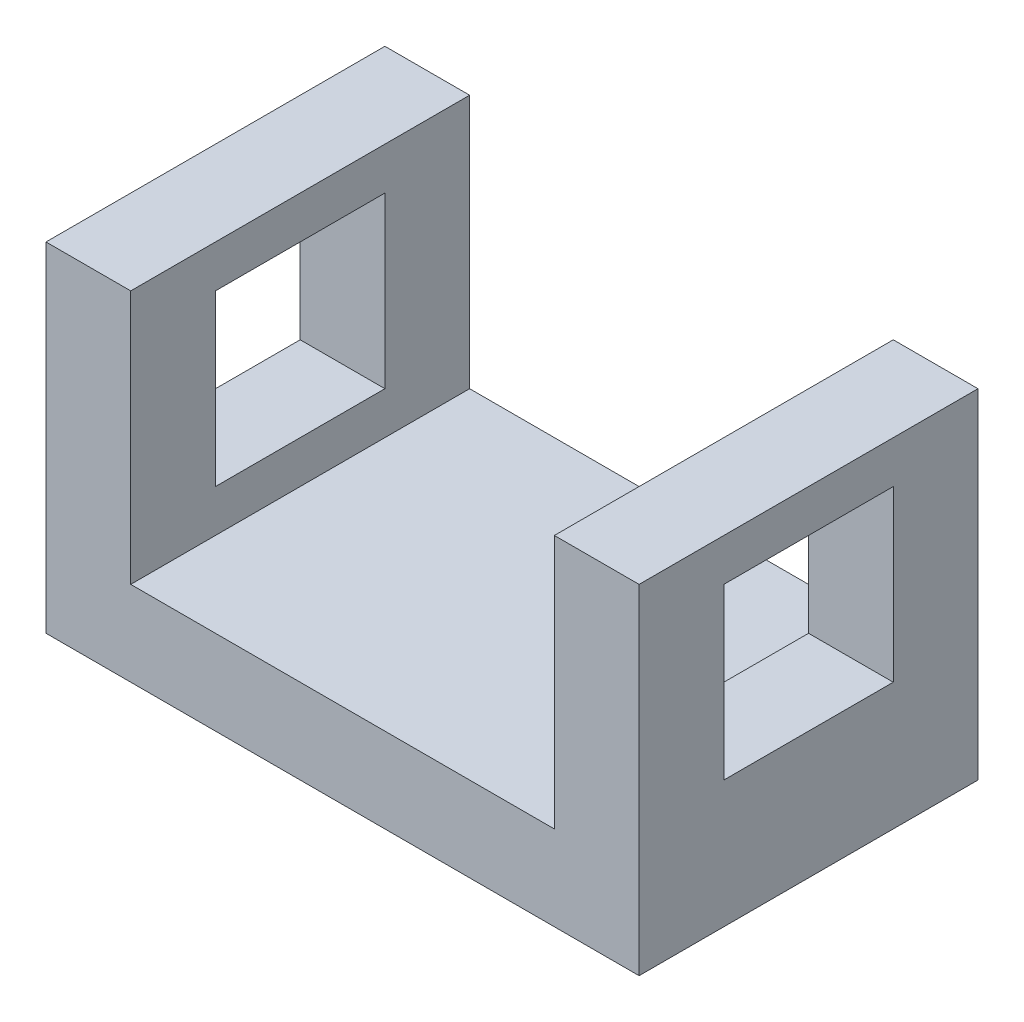
ISO-10303-21;
HEADER;
FILE_DESCRIPTION(('STEP AP214'),'2;1');
FILE_NAME('part.step','',(''),(''),'','','');
FILE_SCHEMA(('AUTOMOTIVE_DESIGN { 1 0 10303 214 1 1 1 1 }'));
ENDSEC;
DATA;
#1=APPLICATION_CONTEXT('core data for automotive mechanical design processes');
#2=APPLICATION_PROTOCOL_DEFINITION('international standard','automotive_design',2000,#1);
#3=PRODUCT_CONTEXT('',#1,'mechanical');
#4=PRODUCT('Part','Part','',(#3));
#5=PRODUCT_RELATED_PRODUCT_CATEGORY('part','',(#4));
#6=PRODUCT_DEFINITION_FORMATION('','',#4);
#7=PRODUCT_DEFINITION_CONTEXT('part definition',#1,'design');
#8=PRODUCT_DEFINITION('design','',#6,#7);
#9=PRODUCT_DEFINITION_SHAPE('','',#8);
#10=(LENGTH_UNIT() NAMED_UNIT(*) SI_UNIT(.MILLI.,.METRE.));
#11=(NAMED_UNIT(*) PLANE_ANGLE_UNIT() SI_UNIT($,.RADIAN.));
#12=(NAMED_UNIT(*) SI_UNIT($,.STERADIAN.) SOLID_ANGLE_UNIT());
#13=UNCERTAINTY_MEASURE_WITH_UNIT(LENGTH_MEASURE(1.E-05),#10,'distance_accuracy_value','');
#14=(GEOMETRIC_REPRESENTATION_CONTEXT(3) GLOBAL_UNCERTAINTY_ASSIGNED_CONTEXT((#13)) GLOBAL_UNIT_ASSIGNED_CONTEXT((#10,
#11,#12)) REPRESENTATION_CONTEXT('',''));
#15=CARTESIAN_POINT('',(0.,0.,0.));
#16=DIRECTION('',(0.,0.,1.));
#17=DIRECTION('',(1.,0.,0.));
#18=AXIS2_PLACEMENT_3D('',#15,#16,#17);
#19=CARTESIAN_POINT('',(-62.4702702702703,35.8905696468509,25.4));
#20=DIRECTION('',(1.,0.,0.));
#21=DIRECTION('',(0.,1.,0.));
#22=AXIS2_PLACEMENT_3D('',#19,#20,#21);
#23=PLANE('',#22);
#24=DIRECTION('',(0.,0.,-1.));
#25=VECTOR('',#24,1.);
#26=CARTESIAN_POINT('',(-62.4702702702703,4.14056964685084,25.4));
#27=LINE('',#26,#25);
#28=CARTESIAN_POINT('',(-62.4702702702703,4.14056964685084,12.7));
#29=VERTEX_POINT('',#28);
#30=CARTESIAN_POINT('',(-62.4702702702703,4.14056964685084,-12.7));
#31=VERTEX_POINT('',#30);
#32=EDGE_CURVE('E164',#29,#31,#27,.T.);
#33=ORIENTED_EDGE('',*,*,#32,.T.);
#34=DIRECTION('',(0.,1.,0.));
#35=VECTOR('',#34,1.);
#36=CARTESIAN_POINT('',(-62.4702702702703,35.8905696468509,-12.7));
#37=LINE('',#36,#35);
#38=CARTESIAN_POINT('',(-62.4702702702703,29.5405696468508,-12.7));
#39=VERTEX_POINT('',#38);
#40=EDGE_CURVE('E157',#31,#39,#37,.T.);
#41=ORIENTED_EDGE('',*,*,#40,.T.);
#42=DIRECTION('',(0.,0.,1.));
#43=VECTOR('',#42,1.);
#44=CARTESIAN_POINT('',(-62.4702702702703,29.5405696468508,25.4));
#45=LINE('',#44,#43);
#46=CARTESIAN_POINT('',(-62.4702702702703,29.5405696468508,12.7));
#47=VERTEX_POINT('',#46);
#48=EDGE_CURVE('E143',#39,#47,#45,.T.);
#49=ORIENTED_EDGE('',*,*,#48,.T.);
#50=DIRECTION('',(0.,-1.,0.));
#51=VECTOR('',#50,1.);
#52=CARTESIAN_POINT('',(-62.4702702702703,35.8905696468509,12.7));
#53=LINE('',#52,#51);
#54=EDGE_CURVE('E263',#47,#29,#53,.T.);
#55=ORIENTED_EDGE('',*,*,#54,.T.);
#56=EDGE_LOOP('',(#33,#41,#49,#55));
#57=FACE_BOUND('',#56,.T.);
#58=DIRECTION('',(0.,-1.,0.));
#59=VECTOR('',#58,1.);
#60=CARTESIAN_POINT('',(-62.4702702702703,35.8905696468509,-25.4));
#61=LINE('',#60,#59);
#62=CARTESIAN_POINT('',(-62.4702702702703,35.8905696468509,-25.4));
#63=VERTEX_POINT('',#62);
#64=CARTESIAN_POINT('',(-62.4702702702703,-14.9094303531491,-25.4));
#65=VERTEX_POINT('',#64);
#66=EDGE_CURVE('E165',#63,#65,#61,.T.);
#67=ORIENTED_EDGE('',*,*,#66,.T.);
#68=DIRECTION('',(0.,0.,-1.));
#69=VECTOR('',#68,1.);
#70=CARTESIAN_POINT('',(-62.4702702702703,-14.9094303531491,25.4));
#71=LINE('',#70,#69);
#72=CARTESIAN_POINT('',(-62.4702702702703,-14.9094303531491,25.4));
#73=VERTEX_POINT('',#72);
#74=EDGE_CURVE('E227',#73,#65,#71,.T.);
#75=ORIENTED_EDGE('',*,*,#74,.F.);
#76=DIRECTION('',(0.,-1.,0.));
#77=VECTOR('',#76,1.);
#78=CARTESIAN_POINT('',(-62.4702702702703,35.8905696468509,25.4));
#79=LINE('',#78,#77);
#80=CARTESIAN_POINT('',(-62.4702702702703,35.8905696468509,25.4));
#81=VERTEX_POINT('',#80);
#82=EDGE_CURVE('E176',#81,#73,#79,.T.);
#83=ORIENTED_EDGE('',*,*,#82,.F.);
#84=DIRECTION('',(0.,0.,-1.));
#85=VECTOR('',#84,1.);
#86=CARTESIAN_POINT('',(-62.4702702702703,35.8905696468509,25.4));
#87=LINE('',#86,#85);
#88=EDGE_CURVE('E193',#81,#63,#87,.T.);
#89=ORIENTED_EDGE('',*,*,#88,.T.);
#90=EDGE_LOOP('',(#67,#75,#83,#89));
#91=FACE_BOUND('',#90,.T.);
#92=ADVANCED_FACE('F33',(#57,#91),#23,.F.);
#93=CARTESIAN_POINT('',(-62.4702702702703,-14.9094303531491,25.4));
#94=DIRECTION('',(0.,1.,0.));
#95=DIRECTION('',(0.,0.,1.));
#96=AXIS2_PLACEMENT_3D('',#93,#94,#95);
#97=PLANE('',#96);
#98=DIRECTION('',(1.,0.,0.));
#99=VECTOR('',#98,1.);
#100=CARTESIAN_POINT('',(-62.4702702702703,-14.9094303531491,-25.4));
#101=LINE('',#100,#99);
#102=CARTESIAN_POINT('',(26.4297297297297,-14.9094303531491,-25.4));
#103=VERTEX_POINT('',#102);
#104=EDGE_CURVE('E169',#65,#103,#101,.T.);
#105=ORIENTED_EDGE('',*,*,#104,.T.);
#106=DIRECTION('',(0.,0.,-1.));
#107=VECTOR('',#106,1.);
#108=CARTESIAN_POINT('',(26.4297297297297,-14.9094303531491,25.4));
#109=LINE('',#108,#107);
#110=CARTESIAN_POINT('',(26.4297297297297,-14.9094303531491,25.4));
#111=VERTEX_POINT('',#110);
#112=EDGE_CURVE('E224',#111,#103,#109,.T.);
#113=ORIENTED_EDGE('',*,*,#112,.F.);
#114=DIRECTION('',(1.,0.,0.));
#115=VECTOR('',#114,1.);
#116=CARTESIAN_POINT('',(-62.4702702702703,-14.9094303531491,25.4));
#117=LINE('',#116,#115);
#118=EDGE_CURVE('E179',#73,#111,#117,.T.);
#119=ORIENTED_EDGE('',*,*,#118,.F.);
#120=ORIENTED_EDGE('',*,*,#74,.T.);
#121=EDGE_LOOP('',(#105,#113,#119,#120));
#122=FACE_BOUND('',#121,.T.);
#123=ADVANCED_FACE('F300',(#122),#97,.F.);
#124=CARTESIAN_POINT('',(26.4297297297297,-14.9094303531491,25.4));
#125=DIRECTION('',(-1.,0.,0.));
#126=DIRECTION('',(0.,-1.,0.));
#127=AXIS2_PLACEMENT_3D('',#124,#125,#126);
#128=PLANE('',#127);
#129=DIRECTION('',(0.,0.,-1.));
#130=VECTOR('',#129,1.);
#131=CARTESIAN_POINT('',(26.4297297297297,29.5405696468508,25.4));
#132=LINE('',#131,#130);
#133=CARTESIAN_POINT('',(26.4297297297297,29.5405696468508,12.7));
#134=VERTEX_POINT('',#133);
#135=CARTESIAN_POINT('',(26.4297297297297,29.5405696468508,-12.7));
#136=VERTEX_POINT('',#135);
#137=EDGE_CURVE('E152',#134,#136,#132,.T.);
#138=ORIENTED_EDGE('',*,*,#137,.T.);
#139=DIRECTION('',(0.,-1.,0.));
#140=VECTOR('',#139,1.);
#141=CARTESIAN_POINT('',(26.4297297297297,-14.9094303531491,-12.7));
#142=LINE('',#141,#140);
#143=CARTESIAN_POINT('',(26.4297297297297,4.14056964685084,-12.7));
#144=VERTEX_POINT('',#143);
#145=EDGE_CURVE('E166',#136,#144,#142,.T.);
#146=ORIENTED_EDGE('',*,*,#145,.T.);
#147=DIRECTION('',(0.,0.,1.));
#148=VECTOR('',#147,1.);
#149=CARTESIAN_POINT('',(26.4297297297297,4.14056964685085,25.4));
#150=LINE('',#149,#148);
#151=CARTESIAN_POINT('',(26.4297297297297,4.14056964685084,12.7));
#152=VERTEX_POINT('',#151);
#153=EDGE_CURVE('E268',#144,#152,#150,.T.);
#154=ORIENTED_EDGE('',*,*,#153,.T.);
#155=DIRECTION('',(0.,1.,0.));
#156=VECTOR('',#155,1.);
#157=CARTESIAN_POINT('',(26.4297297297297,-14.9094303531491,12.7));
#158=LINE('',#157,#156);
#159=EDGE_CURVE('E260',#152,#134,#158,.T.);
#160=ORIENTED_EDGE('',*,*,#159,.T.);
#161=EDGE_LOOP('',(#138,#146,#154,#160));
#162=FACE_BOUND('',#161,.T.);
#163=DIRECTION('',(0.,1.,0.));
#164=VECTOR('',#163,1.);
#165=CARTESIAN_POINT('',(26.4297297297297,-14.9094303531491,-25.4));
#166=LINE('',#165,#164);
#167=CARTESIAN_POINT('',(26.4297297297297,35.8905696468508,-25.4));
#168=VERTEX_POINT('',#167);
#169=EDGE_CURVE('E196',#103,#168,#166,.T.);
#170=ORIENTED_EDGE('',*,*,#169,.T.);
#171=DIRECTION('',(0.,0.,-1.));
#172=VECTOR('',#171,1.);
#173=CARTESIAN_POINT('',(26.4297297297297,35.8905696468508,25.4));
#174=LINE('',#173,#172);
#175=CARTESIAN_POINT('',(26.4297297297297,35.8905696468508,25.4));
#176=VERTEX_POINT('',#175);
#177=EDGE_CURVE('E221',#176,#168,#174,.T.);
#178=ORIENTED_EDGE('',*,*,#177,.F.);
#179=DIRECTION('',(0.,1.,0.));
#180=VECTOR('',#179,1.);
#181=CARTESIAN_POINT('',(26.4297297297297,-14.9094303531491,25.4));
#182=LINE('',#181,#180);
#183=EDGE_CURVE('E182',#111,#176,#182,.T.);
#184=ORIENTED_EDGE('',*,*,#183,.F.);
#185=ORIENTED_EDGE('',*,*,#112,.T.);
#186=EDGE_LOOP('',(#170,#178,#184,#185));
#187=FACE_BOUND('',#186,.T.);
#188=ADVANCED_FACE('F282',(#162,#187),#128,.F.);
#189=CARTESIAN_POINT('',(26.4297297297297,35.8905696468508,25.4));
#190=DIRECTION('',(0.,-1.,0.));
#191=DIRECTION('',(1.,0.,0.));
#192=AXIS2_PLACEMENT_3D('',#189,#190,#191);
#193=PLANE('',#192);
#194=DIRECTION('',(-1.,0.,0.));
#195=VECTOR('',#194,1.);
#196=CARTESIAN_POINT('',(26.4297297297297,35.8905696468508,-25.4));
#197=LINE('',#196,#195);
#198=CARTESIAN_POINT('',(13.7297297297297,35.8905696468509,-25.4));
#199=VERTEX_POINT('',#198);
#200=EDGE_CURVE('E198',#168,#199,#197,.T.);
#201=ORIENTED_EDGE('',*,*,#200,.T.);
#202=DIRECTION('',(0.,0.,-1.));
#203=VECTOR('',#202,1.);
#204=CARTESIAN_POINT('',(13.7297297297297,35.8905696468509,25.4));
#205=LINE('',#204,#203);
#206=CARTESIAN_POINT('',(13.7297297297297,35.8905696468509,25.4));
#207=VERTEX_POINT('',#206);
#208=EDGE_CURVE('E218',#207,#199,#205,.T.);
#209=ORIENTED_EDGE('',*,*,#208,.F.);
#210=DIRECTION('',(-1.,0.,0.));
#211=VECTOR('',#210,1.);
#212=CARTESIAN_POINT('',(26.4297297297297,35.8905696468508,25.4));
#213=LINE('',#212,#211);
#214=EDGE_CURVE('E184',#176,#207,#213,.T.);
#215=ORIENTED_EDGE('',*,*,#214,.F.);
#216=ORIENTED_EDGE('',*,*,#177,.T.);
#217=EDGE_LOOP('',(#201,#209,#215,#216));
#218=FACE_BOUND('',#217,.T.);
#219=ADVANCED_FACE('F308',(#218),#193,.F.);
#220=CARTESIAN_POINT('',(13.7297297297297,35.8905696468509,25.4));
#221=DIRECTION('',(1.,0.,0.));
#222=DIRECTION('',(0.,1.,0.));
#223=AXIS2_PLACEMENT_3D('',#220,#221,#222);
#224=PLANE('',#223);
#225=DIRECTION('',(0.,0.,-1.));
#226=VECTOR('',#225,1.);
#227=CARTESIAN_POINT('',(13.7297297297297,4.14056964685084,25.4));
#228=LINE('',#227,#226);
#229=CARTESIAN_POINT('',(13.7297297297297,4.14056964685084,12.7));
#230=VERTEX_POINT('',#229);
#231=CARTESIAN_POINT('',(13.7297297297297,4.14056964685084,-12.7));
#232=VERTEX_POINT('',#231);
#233=EDGE_CURVE('E265',#230,#232,#228,.T.);
#234=ORIENTED_EDGE('',*,*,#233,.T.);
#235=DIRECTION('',(0.,1.,0.));
#236=VECTOR('',#235,1.);
#237=CARTESIAN_POINT('',(13.7297297297297,35.8905696468509,-12.7));
#238=LINE('',#237,#236);
#239=CARTESIAN_POINT('',(13.7297297297297,29.5405696468508,-12.7));
#240=VERTEX_POINT('',#239);
#241=EDGE_CURVE('E172',#232,#240,#238,.T.);
#242=ORIENTED_EDGE('',*,*,#241,.T.);
#243=DIRECTION('',(0.,0.,1.));
#244=VECTOR('',#243,1.);
#245=CARTESIAN_POINT('',(13.7297297297297,29.5405696468508,25.4));
#246=LINE('',#245,#244);
#247=CARTESIAN_POINT('',(13.7297297297297,29.5405696468508,12.7));
#248=VERTEX_POINT('',#247);
#249=EDGE_CURVE('E244',#240,#248,#246,.T.);
#250=ORIENTED_EDGE('',*,*,#249,.T.);
#251=DIRECTION('',(0.,-1.,0.));
#252=VECTOR('',#251,1.);
#253=CARTESIAN_POINT('',(13.7297297297297,35.8905696468509,12.7));
#254=LINE('',#253,#252);
#255=EDGE_CURVE('E151',#248,#230,#254,.T.);
#256=ORIENTED_EDGE('',*,*,#255,.T.);
#257=EDGE_LOOP('',(#234,#242,#250,#256));
#258=FACE_BOUND('',#257,.T.);
#259=DIRECTION('',(0.,-1.,0.));
#260=VECTOR('',#259,1.);
#261=CARTESIAN_POINT('',(13.7297297297297,35.8905696468509,-25.4));
#262=LINE('',#261,#260);
#263=CARTESIAN_POINT('',(13.7297297297297,-2.20943035314915,-25.4));
#264=VERTEX_POINT('',#263);
#265=EDGE_CURVE('E200',#199,#264,#262,.T.);
#266=ORIENTED_EDGE('',*,*,#265,.T.);
#267=DIRECTION('',(0.,0.,-1.));
#268=VECTOR('',#267,1.);
#269=CARTESIAN_POINT('',(13.7297297297297,-2.20943035314915,25.4));
#270=LINE('',#269,#268);
#271=CARTESIAN_POINT('',(13.7297297297297,-2.20943035314915,25.4));
#272=VERTEX_POINT('',#271);
#273=EDGE_CURVE('E215',#272,#264,#270,.T.);
#274=ORIENTED_EDGE('',*,*,#273,.F.);
#275=DIRECTION('',(0.,-1.,0.));
#276=VECTOR('',#275,1.);
#277=CARTESIAN_POINT('',(13.7297297297297,35.8905696468509,25.4));
#278=LINE('',#277,#276);
#279=EDGE_CURVE('E186',#207,#272,#278,.T.);
#280=ORIENTED_EDGE('',*,*,#279,.F.);
#281=ORIENTED_EDGE('',*,*,#208,.T.);
#282=EDGE_LOOP('',(#266,#274,#280,#281));
#283=FACE_BOUND('',#282,.T.);
#284=ADVANCED_FACE('F273',(#258,#283),#224,.F.);
#285=CARTESIAN_POINT('',(13.7297297297297,-2.20943035314915,25.4));
#286=DIRECTION('',(0.,-1.,0.));
#287=DIRECTION('',(1.,0.,0.));
#288=AXIS2_PLACEMENT_3D('',#285,#286,#287);
#289=PLANE('',#288);
#290=DIRECTION('',(-1.,0.,0.));
#291=VECTOR('',#290,1.);
#292=CARTESIAN_POINT('',(13.7297297297297,-2.20943035314915,-25.4));
#293=LINE('',#292,#291);
#294=CARTESIAN_POINT('',(-49.7702702702703,-2.20943035314915,-25.4));
#295=VERTEX_POINT('',#294);
#296=EDGE_CURVE('E202',#264,#295,#293,.T.);
#297=ORIENTED_EDGE('',*,*,#296,.T.);
#298=DIRECTION('',(0.,0.,-1.));
#299=VECTOR('',#298,1.);
#300=CARTESIAN_POINT('',(-49.7702702702703,-2.20943035314915,25.4));
#301=LINE('',#300,#299);
#302=CARTESIAN_POINT('',(-49.7702702702703,-2.20943035314915,25.4));
#303=VERTEX_POINT('',#302);
#304=EDGE_CURVE('E212',#303,#295,#301,.T.);
#305=ORIENTED_EDGE('',*,*,#304,.F.);
#306=DIRECTION('',(-1.,0.,0.));
#307=VECTOR('',#306,1.);
#308=CARTESIAN_POINT('',(13.7297297297297,-2.20943035314915,25.4));
#309=LINE('',#308,#307);
#310=EDGE_CURVE('E188',#272,#303,#309,.T.);
#311=ORIENTED_EDGE('',*,*,#310,.F.);
#312=ORIENTED_EDGE('',*,*,#273,.T.);
#313=EDGE_LOOP('',(#297,#305,#311,#312));
#314=FACE_BOUND('',#313,.T.);
#315=ADVANCED_FACE('F316',(#314),#289,.F.);
#316=CARTESIAN_POINT('',(-49.7702702702703,-2.20943035314915,25.4));
#317=DIRECTION('',(-1.,0.,0.));
#318=DIRECTION('',(0.,0.,1.));
#319=AXIS2_PLACEMENT_3D('',#316,#317,#318);
#320=PLANE('',#319);
#321=DIRECTION('',(0.,0.,-1.));
#322=VECTOR('',#321,1.);
#323=CARTESIAN_POINT('',(-49.7702702702703,29.5405696468508,25.4));
#324=LINE('',#323,#322);
#325=CARTESIAN_POINT('',(-49.7702702702703,29.5405696468508,12.7));
#326=VERTEX_POINT('',#325);
#327=CARTESIAN_POINT('',(-49.7702702702703,29.5405696468508,-12.7));
#328=VERTEX_POINT('',#327);
#329=EDGE_CURVE('E230',#326,#328,#324,.T.);
#330=ORIENTED_EDGE('',*,*,#329,.T.);
#331=DIRECTION('',(0.,-1.,0.));
#332=VECTOR('',#331,1.);
#333=CARTESIAN_POINT('',(-49.7702702702703,-2.20943035314915,-12.7));
#334=LINE('',#333,#332);
#335=CARTESIAN_POINT('',(-49.7702702702703,4.14056964685084,-12.7));
#336=VERTEX_POINT('',#335);
#337=EDGE_CURVE('E11',#328,#336,#334,.T.);
#338=ORIENTED_EDGE('',*,*,#337,.T.);
#339=DIRECTION('',(0.,0.,1.));
#340=VECTOR('',#339,1.);
#341=CARTESIAN_POINT('',(-49.7702702702703,4.14056964685084,25.4));
#342=LINE('',#341,#340);
#343=CARTESIAN_POINT('',(-49.7702702702703,4.14056964685084,12.7));
#344=VERTEX_POINT('',#343);
#345=EDGE_CURVE('E40',#336,#344,#342,.T.);
#346=ORIENTED_EDGE('',*,*,#345,.T.);
#347=DIRECTION('',(0.,1.,0.));
#348=VECTOR('',#347,1.);
#349=CARTESIAN_POINT('',(-49.7702702702703,-2.20943035314915,12.7));
#350=LINE('',#349,#348);
#351=EDGE_CURVE('E232',#344,#326,#350,.T.);
#352=ORIENTED_EDGE('',*,*,#351,.T.);
#353=EDGE_LOOP('',(#330,#338,#346,#352));
#354=FACE_BOUND('',#353,.T.);
#355=DIRECTION('',(0.,1.,0.));
#356=VECTOR('',#355,1.);
#357=CARTESIAN_POINT('',(-49.7702702702703,-2.20943035314915,-25.4));
#358=LINE('',#357,#356);
#359=CARTESIAN_POINT('',(-49.7702702702703,35.8905696468508,-25.4));
#360=VERTEX_POINT('',#359);
#361=EDGE_CURVE('E204',#295,#360,#358,.T.);
#362=ORIENTED_EDGE('',*,*,#361,.T.);
#363=DIRECTION('',(0.,0.,-1.));
#364=VECTOR('',#363,1.);
#365=CARTESIAN_POINT('',(-49.7702702702703,35.8905696468508,25.4));
#366=LINE('',#365,#364);
#367=CARTESIAN_POINT('',(-49.7702702702703,35.8905696468508,25.4));
#368=VERTEX_POINT('',#367);
#369=EDGE_CURVE('E209',#368,#360,#366,.T.);
#370=ORIENTED_EDGE('',*,*,#369,.F.);
#371=DIRECTION('',(0.,1.,0.));
#372=VECTOR('',#371,1.);
#373=CARTESIAN_POINT('',(-49.7702702702703,-2.20943035314915,25.4));
#374=LINE('',#373,#372);
#375=EDGE_CURVE('E190',#303,#368,#374,.T.);
#376=ORIENTED_EDGE('',*,*,#375,.F.);
#377=ORIENTED_EDGE('',*,*,#304,.T.);
#378=EDGE_LOOP('',(#362,#370,#376,#377));
#379=FACE_BOUND('',#378,.T.);
#380=ADVANCED_FACE('F236',(#354,#379),#320,.F.);
#381=CARTESIAN_POINT('',(-49.7702702702703,35.8905696468508,25.4));
#382=DIRECTION('',(0.,-1.,0.));
#383=DIRECTION('',(1.,0.,0.));
#384=AXIS2_PLACEMENT_3D('',#381,#382,#383);
#385=PLANE('',#384);
#386=DIRECTION('',(-1.,0.,0.));
#387=VECTOR('',#386,1.);
#388=CARTESIAN_POINT('',(-49.7702702702703,35.8905696468508,-25.4));
#389=LINE('',#388,#387);
#390=EDGE_CURVE('E180',#360,#63,#389,.T.);
#391=ORIENTED_EDGE('',*,*,#390,.T.);
#392=ORIENTED_EDGE('',*,*,#88,.F.);
#393=DIRECTION('',(-1.,0.,0.));
#394=VECTOR('',#393,1.);
#395=CARTESIAN_POINT('',(-49.7702702702703,35.8905696468508,25.4));
#396=LINE('',#395,#394);
#397=EDGE_CURVE('E192',#368,#81,#396,.T.);
#398=ORIENTED_EDGE('',*,*,#397,.F.);
#399=ORIENTED_EDGE('',*,*,#369,.T.);
#400=EDGE_LOOP('',(#391,#392,#398,#399));
#401=FACE_BOUND('',#400,.T.);
#402=ADVANCED_FACE('F322',(#401),#385,.F.);
#403=CARTESIAN_POINT('',(0.,0.,25.4));
#404=DIRECTION('',(0.,0.,1.));
#405=DIRECTION('',(1.,0.,0.));
#406=AXIS2_PLACEMENT_3D('',#403,#404,#405);
#407=PLANE('',#406);
#408=ORIENTED_EDGE('',*,*,#82,.T.);
#409=ORIENTED_EDGE('',*,*,#118,.T.);
#410=ORIENTED_EDGE('',*,*,#183,.T.);
#411=ORIENTED_EDGE('',*,*,#214,.T.);
#412=ORIENTED_EDGE('',*,*,#279,.T.);
#413=ORIENTED_EDGE('',*,*,#310,.T.);
#414=ORIENTED_EDGE('',*,*,#375,.T.);
#415=ORIENTED_EDGE('',*,*,#397,.T.);
#416=EDGE_LOOP('',(#408,#409,#410,#411,#412,#413,#414,#415));
#417=FACE_BOUND('',#416,.T.);
#418=ADVANCED_FACE('F325',(#417),#407,.T.);
#419=CARTESIAN_POINT('',(0.,0.,-25.4));
#420=DIRECTION('',(0.,0.,1.));
#421=DIRECTION('',(1.,0.,0.));
#422=AXIS2_PLACEMENT_3D('',#419,#420,#421);
#423=PLANE('',#422);
#424=ORIENTED_EDGE('',*,*,#66,.F.);
#425=ORIENTED_EDGE('',*,*,#390,.F.);
#426=ORIENTED_EDGE('',*,*,#361,.F.);
#427=ORIENTED_EDGE('',*,*,#296,.F.);
#428=ORIENTED_EDGE('',*,*,#265,.F.);
#429=ORIENTED_EDGE('',*,*,#200,.F.);
#430=ORIENTED_EDGE('',*,*,#169,.F.);
#431=ORIENTED_EDGE('',*,*,#104,.F.);
#432=EDGE_LOOP('',(#424,#425,#426,#427,#428,#429,#430,#431));
#433=FACE_BOUND('',#432,.T.);
#434=ADVANCED_FACE('F327',(#433),#423,.F.);
#435=CARTESIAN_POINT('',(-76.2,29.5405696468508,-12.7));
#436=DIRECTION('',(0.,1.,0.));
#437=DIRECTION('',(0.,0.,1.));
#438=AXIS2_PLACEMENT_3D('',#435,#436,#437);
#439=PLANE('',#438);
#440=DIRECTION('',(1.,0.,0.));
#441=VECTOR('',#440,1.);
#442=CARTESIAN_POINT('',(-76.2,29.5405696468508,-12.7));
#443=LINE('',#442,#441);
#444=EDGE_CURVE('E146',#39,#328,#443,.T.);
#445=ORIENTED_EDGE('',*,*,#444,.T.);
#446=ORIENTED_EDGE('',*,*,#329,.F.);
#447=DIRECTION('',(1.,0.,0.));
#448=VECTOR('',#447,1.);
#449=CARTESIAN_POINT('',(-76.2,29.5405696468508,12.7));
#450=LINE('',#449,#448);
#451=EDGE_CURVE('E47',#47,#326,#450,.T.);
#452=ORIENTED_EDGE('',*,*,#451,.F.);
#453=ORIENTED_EDGE('',*,*,#48,.F.);
#454=EDGE_LOOP('',(#445,#446,#452,#453));
#455=FACE_BOUND('',#454,.T.);
#456=ADVANCED_FACE('F145',(#455),#439,.F.);
#457=CARTESIAN_POINT('',(-76.2,29.5405696468508,12.7));
#458=DIRECTION('',(0.,0.,1.));
#459=DIRECTION('',(0.,-1.,0.));
#460=AXIS2_PLACEMENT_3D('',#457,#458,#459);
#461=PLANE('',#460);
#462=ORIENTED_EDGE('',*,*,#451,.T.);
#463=ORIENTED_EDGE('',*,*,#351,.F.);
#464=DIRECTION('',(1.,0.,0.));
#465=VECTOR('',#464,1.);
#466=CARTESIAN_POINT('',(-76.2,4.14056964685084,12.7));
#467=LINE('',#466,#465);
#468=EDGE_CURVE('E243',#29,#344,#467,.T.);
#469=ORIENTED_EDGE('',*,*,#468,.F.);
#470=ORIENTED_EDGE('',*,*,#54,.F.);
#471=EDGE_LOOP('',(#462,#463,#469,#470));
#472=FACE_BOUND('',#471,.T.);
#473=ADVANCED_FACE('F290',(#472),#461,.F.);
#474=CARTESIAN_POINT('',(-76.2,4.14056964685084,12.7));
#475=DIRECTION('',(0.,-1.,0.));
#476=DIRECTION('',(0.,0.,-1.));
#477=AXIS2_PLACEMENT_3D('',#474,#475,#476);
#478=PLANE('',#477);
#479=ORIENTED_EDGE('',*,*,#468,.T.);
#480=ORIENTED_EDGE('',*,*,#345,.F.);
#481=DIRECTION('',(1.,0.,0.));
#482=VECTOR('',#481,1.);
#483=CARTESIAN_POINT('',(-76.2,4.14056964685084,-12.7));
#484=LINE('',#483,#482);
#485=EDGE_CURVE('E241',#31,#336,#484,.T.);
#486=ORIENTED_EDGE('',*,*,#485,.F.);
#487=ORIENTED_EDGE('',*,*,#32,.F.);
#488=EDGE_LOOP('',(#479,#480,#486,#487));
#489=FACE_BOUND('',#488,.T.);
#490=ADVANCED_FACE('F240',(#489),#478,.F.);
#491=CARTESIAN_POINT('',(-76.2,4.14056964685084,-12.7));
#492=DIRECTION('',(0.,0.,-1.));
#493=DIRECTION('',(-1.,0.,0.));
#494=AXIS2_PLACEMENT_3D('',#491,#492,#493);
#495=PLANE('',#494);
#496=ORIENTED_EDGE('',*,*,#485,.T.);
#497=ORIENTED_EDGE('',*,*,#337,.F.);
#498=ORIENTED_EDGE('',*,*,#444,.F.);
#499=ORIENTED_EDGE('',*,*,#40,.F.);
#500=EDGE_LOOP('',(#496,#497,#498,#499));
#501=FACE_BOUND('',#500,.T.);
#502=ADVANCED_FACE('F156',(#501),#495,.F.);
#503=EDGE_CURVE('E55',#240,#136,#443,.T.);
#504=ORIENTED_EDGE('',*,*,#503,.F.);
#505=ORIENTED_EDGE('',*,*,#241,.F.);
#506=EDGE_CURVE('E245',#232,#144,#484,.T.);
#507=ORIENTED_EDGE('',*,*,#506,.T.);
#508=ORIENTED_EDGE('',*,*,#145,.F.);
#509=EDGE_LOOP('',(#504,#505,#507,#508));
#510=FACE_BOUND('',#509,.T.);
#511=ADVANCED_FACE('F277',(#510),#495,.F.);
#512=ORIENTED_EDGE('',*,*,#506,.F.);
#513=ORIENTED_EDGE('',*,*,#233,.F.);
#514=EDGE_CURVE('E251',#230,#152,#467,.T.);
#515=ORIENTED_EDGE('',*,*,#514,.T.);
#516=ORIENTED_EDGE('',*,*,#153,.F.);
#517=EDGE_LOOP('',(#512,#513,#515,#516));
#518=FACE_BOUND('',#517,.T.);
#519=ADVANCED_FACE('F279',(#518),#478,.F.);
#520=ORIENTED_EDGE('',*,*,#514,.F.);
#521=ORIENTED_EDGE('',*,*,#255,.F.);
#522=EDGE_CURVE('E160',#248,#134,#450,.T.);
#523=ORIENTED_EDGE('',*,*,#522,.T.);
#524=ORIENTED_EDGE('',*,*,#159,.F.);
#525=EDGE_LOOP('',(#520,#521,#523,#524));
#526=FACE_BOUND('',#525,.T.);
#527=ADVANCED_FACE('F287',(#526),#461,.F.);
#528=ORIENTED_EDGE('',*,*,#522,.F.);
#529=ORIENTED_EDGE('',*,*,#249,.F.);
#530=ORIENTED_EDGE('',*,*,#503,.T.);
#531=ORIENTED_EDGE('',*,*,#137,.F.);
#532=EDGE_LOOP('',(#528,#529,#530,#531));
#533=FACE_BOUND('',#532,.T.);
#534=ADVANCED_FACE('F284',(#533),#439,.F.);
#535=CLOSED_SHELL('',(#92,#123,#188,#219,#284,#315,#380,#402,#418,#434,#456,#473,#490,#502,#511,
#519,#527,#534));
#536=MANIFOLD_SOLID_BREP('B2',#535);
#537=ADVANCED_BREP_SHAPE_REPRESENTATION('',(#18,#536),#14);
#538=SHAPE_DEFINITION_REPRESENTATION(#9,#537);
ENDSEC;
END-ISO-10303-21;
